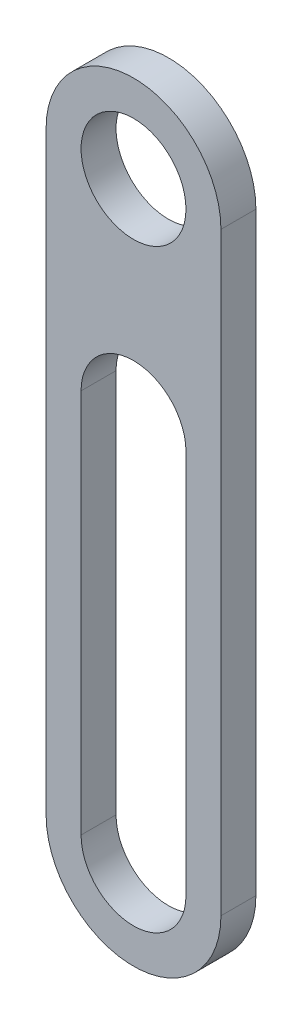
ISO-10303-21;
HEADER;
FILE_DESCRIPTION(('STEP AP214'),'2;1');
FILE_NAME('part.step','',(''),(''),'','','');
FILE_SCHEMA(('AUTOMOTIVE_DESIGN { 1 0 10303 214 1 1 1 1 }'));
ENDSEC;
DATA;
#1=APPLICATION_CONTEXT('core data for automotive mechanical design processes');
#2=APPLICATION_PROTOCOL_DEFINITION('international standard','automotive_design',2000,#1);
#3=PRODUCT_CONTEXT('',#1,'mechanical');
#4=PRODUCT('Part','Part','',(#3));
#5=PRODUCT_RELATED_PRODUCT_CATEGORY('part','',(#4));
#6=PRODUCT_DEFINITION_FORMATION('','',#4);
#7=PRODUCT_DEFINITION_CONTEXT('part definition',#1,'design');
#8=PRODUCT_DEFINITION('design','',#6,#7);
#9=PRODUCT_DEFINITION_SHAPE('','',#8);
#10=(LENGTH_UNIT() NAMED_UNIT(*) SI_UNIT(.MILLI.,.METRE.));
#11=(NAMED_UNIT(*) PLANE_ANGLE_UNIT() SI_UNIT($,.RADIAN.));
#12=(NAMED_UNIT(*) SI_UNIT($,.STERADIAN.) SOLID_ANGLE_UNIT());
#13=UNCERTAINTY_MEASURE_WITH_UNIT(LENGTH_MEASURE(1.E-05),#10,'distance_accuracy_value','');
#14=(GEOMETRIC_REPRESENTATION_CONTEXT(3) GLOBAL_UNCERTAINTY_ASSIGNED_CONTEXT((#13)) GLOBAL_UNIT_ASSIGNED_CONTEXT((#10,
#11,#12)) REPRESENTATION_CONTEXT('',''));
#15=CARTESIAN_POINT('',(0.,0.,0.));
#16=DIRECTION('',(0.,0.,1.));
#17=DIRECTION('',(1.,0.,0.));
#18=AXIS2_PLACEMENT_3D('',#15,#16,#17);
#19=CARTESIAN_POINT('',(0.,11.5,1.));
#20=DIRECTION('',(0.,0.,-1.));
#21=DIRECTION('',(-1.,0.,0.));
#22=AXIS2_PLACEMENT_3D('',#19,#20,#21);
#23=PLANE('',#22);
#24=CARTESIAN_POINT('',(0.,11.5,1.));
#25=DIRECTION('',(0.,0.,1.));
#26=DIRECTION('',(-1.,0.,0.));
#27=AXIS2_PLACEMENT_3D('',#24,#25,#26);
#28=CIRCLE('',#27,2.5);
#29=CARTESIAN_POINT('',(2.5,11.5,1.));
#30=VERTEX_POINT('',#29);
#31=CARTESIAN_POINT('',(-2.5,11.5,1.));
#32=VERTEX_POINT('',#31);
#33=EDGE_CURVE('E141',#30,#32,#28,.T.);
#34=ORIENTED_EDGE('',*,*,#33,.T.);
#35=DIRECTION('',(0.,-1.,0.));
#36=VECTOR('',#35,1.);
#37=CARTESIAN_POINT('',(-2.5,11.5,1.));
#38=LINE('',#37,#36);
#39=CARTESIAN_POINT('',(-2.5,-5.5,1.));
#40=VERTEX_POINT('',#39);
#41=EDGE_CURVE('E144',#32,#40,#38,.T.);
#42=ORIENTED_EDGE('',*,*,#41,.T.);
#43=CARTESIAN_POINT('',(0.,-5.5,1.));
#44=DIRECTION('',(0.,0.,1.));
#45=DIRECTION('',(1.,0.,0.));
#46=AXIS2_PLACEMENT_3D('',#43,#44,#45);
#47=CIRCLE('',#46,2.5);
#48=CARTESIAN_POINT('',(2.5,-5.5,1.));
#49=VERTEX_POINT('',#48);
#50=EDGE_CURVE('E147',#40,#49,#47,.T.);
#51=ORIENTED_EDGE('',*,*,#50,.T.);
#52=DIRECTION('',(0.,1.,0.));
#53=VECTOR('',#52,1.);
#54=CARTESIAN_POINT('',(2.5,11.5,1.));
#55=LINE('',#54,#53);
#56=EDGE_CURVE('E149',#49,#30,#55,.T.);
#57=ORIENTED_EDGE('',*,*,#56,.T.);
#58=EDGE_LOOP('',(#34,#42,#51,#57));
#59=FACE_BOUND('',#58,.T.);
#60=CARTESIAN_POINT('',(0.,-5.5,1.));
#61=DIRECTION('',(0.,0.,1.));
#62=DIRECTION('',(1.,0.,0.));
#63=AXIS2_PLACEMENT_3D('',#60,#61,#62);
#64=CIRCLE('',#63,1.5);
#65=CARTESIAN_POINT('',(-1.5,-5.5,1.));
#66=VERTEX_POINT('',#65);
#67=CARTESIAN_POINT('',(1.5,-5.5,1.));
#68=VERTEX_POINT('',#67);
#69=EDGE_CURVE('E102',#66,#68,#64,.T.);
#70=ORIENTED_EDGE('',*,*,#69,.F.);
#71=DIRECTION('',(0.,-1.,0.));
#72=VECTOR('',#71,1.);
#73=CARTESIAN_POINT('',(-1.5,-5.5,1.));
#74=LINE('',#73,#72);
#75=CARTESIAN_POINT('',(-1.5,5.5,1.));
#76=VERTEX_POINT('',#75);
#77=EDGE_CURVE('E125',#76,#66,#74,.T.);
#78=ORIENTED_EDGE('',*,*,#77,.F.);
#79=CARTESIAN_POINT('',(0.,5.5,1.));
#80=DIRECTION('',(0.,0.,1.));
#81=DIRECTION('',(1.,0.,0.));
#82=AXIS2_PLACEMENT_3D('',#79,#80,#81);
#83=CIRCLE('',#82,1.5);
#84=CARTESIAN_POINT('',(1.5,5.5,1.));
#85=VERTEX_POINT('',#84);
#86=EDGE_CURVE('E123',#85,#76,#83,.T.);
#87=ORIENTED_EDGE('',*,*,#86,.F.);
#88=DIRECTION('',(0.,1.,0.));
#89=VECTOR('',#88,1.);
#90=CARTESIAN_POINT('',(1.5,-5.5,1.));
#91=LINE('',#90,#89);
#92=EDGE_CURVE('E110',#68,#85,#91,.T.);
#93=ORIENTED_EDGE('',*,*,#92,.F.);
#94=EDGE_LOOP('',(#70,#78,#87,#93));
#95=FACE_BOUND('',#94,.T.);
#96=CARTESIAN_POINT('',(0.,11.5,1.));
#97=DIRECTION('',(0.,0.,1.));
#98=DIRECTION('',(1.,0.,0.));
#99=AXIS2_PLACEMENT_3D('',#96,#97,#98);
#100=CIRCLE('',#99,1.5);
#101=CARTESIAN_POINT('',(1.5,11.5,1.));
#102=VERTEX_POINT('',#101);
#103=EDGE_CURVE('E131',#102,#102,#100,.T.);
#104=ORIENTED_EDGE('',*,*,#103,.F.);
#105=EDGE_LOOP('',(#104));
#106=FACE_BOUND('',#105,.T.);
#107=ADVANCED_FACE('F37',(#59,#95,#106),#23,.F.);
#108=CARTESIAN_POINT('',(0.,11.5,0.));
#109=DIRECTION('',(0.,0.,-1.));
#110=DIRECTION('',(-1.,0.,0.));
#111=AXIS2_PLACEMENT_3D('',#108,#109,#110);
#112=PLANE('',#111);
#113=DIRECTION('',(0.,-1.,0.));
#114=VECTOR('',#113,1.);
#115=CARTESIAN_POINT('',(-1.5,-5.5,0.));
#116=LINE('',#115,#114);
#117=CARTESIAN_POINT('',(-1.5,5.5,0.));
#118=VERTEX_POINT('',#117);
#119=CARTESIAN_POINT('',(-1.5,-5.5,0.));
#120=VERTEX_POINT('',#119);
#121=EDGE_CURVE('E111',#118,#120,#116,.T.);
#122=ORIENTED_EDGE('',*,*,#121,.T.);
#123=CARTESIAN_POINT('',(0.,-5.5,0.));
#124=DIRECTION('',(0.,0.,1.));
#125=DIRECTION('',(1.,0.,0.));
#126=AXIS2_PLACEMENT_3D('',#123,#124,#125);
#127=CIRCLE('',#126,1.5);
#128=CARTESIAN_POINT('',(1.5,-5.5,0.));
#129=VERTEX_POINT('',#128);
#130=EDGE_CURVE('E60',#120,#129,#127,.T.);
#131=ORIENTED_EDGE('',*,*,#130,.T.);
#132=DIRECTION('',(0.,1.,0.));
#133=VECTOR('',#132,1.);
#134=CARTESIAN_POINT('',(1.5,-5.5,0.));
#135=LINE('',#134,#133);
#136=CARTESIAN_POINT('',(1.5,5.5,0.));
#137=VERTEX_POINT('',#136);
#138=EDGE_CURVE('E117',#129,#137,#135,.T.);
#139=ORIENTED_EDGE('',*,*,#138,.T.);
#140=CARTESIAN_POINT('',(0.,5.5,0.));
#141=DIRECTION('',(0.,0.,1.));
#142=DIRECTION('',(1.,0.,0.));
#143=AXIS2_PLACEMENT_3D('',#140,#141,#142);
#144=CIRCLE('',#143,1.5);
#145=EDGE_CURVE('E133',#137,#118,#144,.T.);
#146=ORIENTED_EDGE('',*,*,#145,.T.);
#147=EDGE_LOOP('',(#122,#131,#139,#146));
#148=FACE_BOUND('',#147,.T.);
#149=CARTESIAN_POINT('',(0.,11.5,0.));
#150=DIRECTION('',(0.,0.,1.));
#151=DIRECTION('',(-1.,0.,0.));
#152=AXIS2_PLACEMENT_3D('',#149,#150,#151);
#153=CIRCLE('',#152,2.5);
#154=CARTESIAN_POINT('',(2.5,11.5,0.));
#155=VERTEX_POINT('',#154);
#156=CARTESIAN_POINT('',(-2.5,11.5,0.));
#157=VERTEX_POINT('',#156);
#158=EDGE_CURVE('E118',#155,#157,#153,.T.);
#159=ORIENTED_EDGE('',*,*,#158,.F.);
#160=DIRECTION('',(0.,1.,0.));
#161=VECTOR('',#160,1.);
#162=CARTESIAN_POINT('',(2.5,11.5,0.));
#163=LINE('',#162,#161);
#164=CARTESIAN_POINT('',(2.5,-5.5,0.));
#165=VERTEX_POINT('',#164);
#166=EDGE_CURVE('E145',#165,#155,#163,.T.);
#167=ORIENTED_EDGE('',*,*,#166,.F.);
#168=CARTESIAN_POINT('',(0.,-5.5,0.));
#169=DIRECTION('',(0.,0.,1.));
#170=DIRECTION('',(1.,0.,0.));
#171=AXIS2_PLACEMENT_3D('',#168,#169,#170);
#172=CIRCLE('',#171,2.5);
#173=CARTESIAN_POINT('',(-2.5,-5.5,0.));
#174=VERTEX_POINT('',#173);
#175=EDGE_CURVE('E156',#174,#165,#172,.T.);
#176=ORIENTED_EDGE('',*,*,#175,.F.);
#177=DIRECTION('',(0.,-1.,0.));
#178=VECTOR('',#177,1.);
#179=CARTESIAN_POINT('',(-2.5,11.5,0.));
#180=LINE('',#179,#178);
#181=EDGE_CURVE('E154',#157,#174,#180,.T.);
#182=ORIENTED_EDGE('',*,*,#181,.F.);
#183=EDGE_LOOP('',(#159,#167,#176,#182));
#184=FACE_BOUND('',#183,.T.);
#185=CARTESIAN_POINT('',(0.,11.5,0.));
#186=DIRECTION('',(0.,0.,1.));
#187=DIRECTION('',(1.,0.,0.));
#188=AXIS2_PLACEMENT_3D('',#185,#186,#187);
#189=CIRCLE('',#188,1.5);
#190=CARTESIAN_POINT('',(1.5,11.5,0.));
#191=VERTEX_POINT('',#190);
#192=EDGE_CURVE('E228',#191,#191,#189,.T.);
#193=ORIENTED_EDGE('',*,*,#192,.T.);
#194=EDGE_LOOP('',(#193));
#195=FACE_BOUND('',#194,.T.);
#196=ADVANCED_FACE('F174',(#148,#184,#195),#112,.T.);
#197=CARTESIAN_POINT('',(0.,11.5,1.));
#198=DIRECTION('',(0.,0.,-1.));
#199=DIRECTION('',(-1.,0.,0.));
#200=AXIS2_PLACEMENT_3D('',#197,#198,#199);
#201=CYLINDRICAL_SURFACE('',#200,2.5);
#202=ORIENTED_EDGE('',*,*,#158,.T.);
#203=DIRECTION('',(0.,0.,-1.));
#204=VECTOR('',#203,1.);
#205=CARTESIAN_POINT('',(-2.5,11.5,1.));
#206=LINE('',#205,#204);
#207=EDGE_CURVE('E11',#32,#157,#206,.T.);
#208=ORIENTED_EDGE('',*,*,#207,.F.);
#209=ORIENTED_EDGE('',*,*,#33,.F.);
#210=DIRECTION('',(0.,0.,-1.));
#211=VECTOR('',#210,1.);
#212=CARTESIAN_POINT('',(2.5,11.5,1.));
#213=LINE('',#212,#211);
#214=EDGE_CURVE('E151',#30,#155,#213,.T.);
#215=ORIENTED_EDGE('',*,*,#214,.T.);
#216=EDGE_LOOP('',(#202,#208,#209,#215));
#217=FACE_BOUND('',#216,.T.);
#218=ADVANCED_FACE('F39',(#217),#201,.T.);
#219=CARTESIAN_POINT('',(-2.5,11.5,1.));
#220=DIRECTION('',(1.,0.,0.));
#221=DIRECTION('',(0.,0.,-1.));
#222=AXIS2_PLACEMENT_3D('',#219,#220,#221);
#223=PLANE('',#222);
#224=ORIENTED_EDGE('',*,*,#181,.T.);
#225=DIRECTION('',(0.,0.,-1.));
#226=VECTOR('',#225,1.);
#227=CARTESIAN_POINT('',(-2.5,-5.5,1.));
#228=LINE('',#227,#226);
#229=EDGE_CURVE('E45',#40,#174,#228,.T.);
#230=ORIENTED_EDGE('',*,*,#229,.F.);
#231=ORIENTED_EDGE('',*,*,#41,.F.);
#232=ORIENTED_EDGE('',*,*,#207,.T.);
#233=EDGE_LOOP('',(#224,#230,#231,#232));
#234=FACE_BOUND('',#233,.T.);
#235=ADVANCED_FACE('F184',(#234),#223,.F.);
#236=CARTESIAN_POINT('',(0.,-5.5,1.));
#237=DIRECTION('',(0.,0.,-1.));
#238=DIRECTION('',(-1.,0.,0.));
#239=AXIS2_PLACEMENT_3D('',#236,#237,#238);
#240=CYLINDRICAL_SURFACE('',#239,2.5);
#241=ORIENTED_EDGE('',*,*,#175,.T.);
#242=DIRECTION('',(0.,0.,-1.));
#243=VECTOR('',#242,1.);
#244=CARTESIAN_POINT('',(2.5,-5.5,1.));
#245=LINE('',#244,#243);
#246=EDGE_CURVE('E161',#49,#165,#245,.T.);
#247=ORIENTED_EDGE('',*,*,#246,.F.);
#248=ORIENTED_EDGE('',*,*,#50,.F.);
#249=ORIENTED_EDGE('',*,*,#229,.T.);
#250=EDGE_LOOP('',(#241,#247,#248,#249));
#251=FACE_BOUND('',#250,.T.);
#252=ADVANCED_FACE('F168',(#251),#240,.T.);
#253=CARTESIAN_POINT('',(2.5,11.5,1.));
#254=DIRECTION('',(-1.,0.,0.));
#255=DIRECTION('',(0.,0.,1.));
#256=AXIS2_PLACEMENT_3D('',#253,#254,#255);
#257=PLANE('',#256);
#258=ORIENTED_EDGE('',*,*,#166,.T.);
#259=ORIENTED_EDGE('',*,*,#214,.F.);
#260=ORIENTED_EDGE('',*,*,#56,.F.);
#261=ORIENTED_EDGE('',*,*,#246,.T.);
#262=EDGE_LOOP('',(#258,#259,#260,#261));
#263=FACE_BOUND('',#262,.T.);
#264=ADVANCED_FACE('F178',(#263),#257,.F.);
#265=CARTESIAN_POINT('',(0.,-5.5,1.));
#266=DIRECTION('',(0.,0.,-1.));
#267=DIRECTION('',(-1.,0.,0.));
#268=AXIS2_PLACEMENT_3D('',#265,#266,#267);
#269=CYLINDRICAL_SURFACE('',#268,1.5);
#270=ORIENTED_EDGE('',*,*,#130,.F.);
#271=DIRECTION('',(0.,0.,-1.));
#272=VECTOR('',#271,1.);
#273=CARTESIAN_POINT('',(-1.5,-5.5,1.));
#274=LINE('',#273,#272);
#275=EDGE_CURVE('E106',#66,#120,#274,.T.);
#276=ORIENTED_EDGE('',*,*,#275,.F.);
#277=ORIENTED_EDGE('',*,*,#69,.T.);
#278=DIRECTION('',(0.,0.,-1.));
#279=VECTOR('',#278,1.);
#280=CARTESIAN_POINT('',(1.5,-5.5,1.));
#281=LINE('',#280,#279);
#282=EDGE_CURVE('E105',#68,#129,#281,.T.);
#283=ORIENTED_EDGE('',*,*,#282,.T.);
#284=EDGE_LOOP('',(#270,#276,#277,#283));
#285=FACE_BOUND('',#284,.T.);
#286=ADVANCED_FACE('F104',(#285),#269,.F.);
#287=CARTESIAN_POINT('',(1.5,-5.5,1.));
#288=DIRECTION('',(-1.,0.,0.));
#289=DIRECTION('',(0.,-1.,0.));
#290=AXIS2_PLACEMENT_3D('',#287,#288,#289);
#291=PLANE('',#290);
#292=ORIENTED_EDGE('',*,*,#138,.F.);
#293=ORIENTED_EDGE('',*,*,#282,.F.);
#294=ORIENTED_EDGE('',*,*,#92,.T.);
#295=DIRECTION('',(0.,0.,-1.));
#296=VECTOR('',#295,1.);
#297=CARTESIAN_POINT('',(1.5,5.5,1.));
#298=LINE('',#297,#296);
#299=EDGE_CURVE('E119',#85,#137,#298,.T.);
#300=ORIENTED_EDGE('',*,*,#299,.T.);
#301=EDGE_LOOP('',(#292,#293,#294,#300));
#302=FACE_BOUND('',#301,.T.);
#303=ADVANCED_FACE('F114',(#302),#291,.T.);
#304=CARTESIAN_POINT('',(0.,5.5,1.));
#305=DIRECTION('',(0.,0.,-1.));
#306=DIRECTION('',(-1.,0.,0.));
#307=AXIS2_PLACEMENT_3D('',#304,#305,#306);
#308=CYLINDRICAL_SURFACE('',#307,1.5);
#309=ORIENTED_EDGE('',*,*,#145,.F.);
#310=ORIENTED_EDGE('',*,*,#299,.F.);
#311=ORIENTED_EDGE('',*,*,#86,.T.);
#312=DIRECTION('',(0.,0.,-1.));
#313=VECTOR('',#312,1.);
#314=CARTESIAN_POINT('',(-1.5,5.5,1.));
#315=LINE('',#314,#313);
#316=EDGE_CURVE('E52',#76,#118,#315,.T.);
#317=ORIENTED_EDGE('',*,*,#316,.T.);
#318=EDGE_LOOP('',(#309,#310,#311,#317));
#319=FACE_BOUND('',#318,.T.);
#320=ADVANCED_FACE('F208',(#319),#308,.F.);
#321=CARTESIAN_POINT('',(-1.5,-5.5,1.));
#322=DIRECTION('',(1.,0.,0.));
#323=DIRECTION('',(0.,1.,0.));
#324=AXIS2_PLACEMENT_3D('',#321,#322,#323);
#325=PLANE('',#324);
#326=ORIENTED_EDGE('',*,*,#121,.F.);
#327=ORIENTED_EDGE('',*,*,#316,.F.);
#328=ORIENTED_EDGE('',*,*,#77,.T.);
#329=ORIENTED_EDGE('',*,*,#275,.T.);
#330=EDGE_LOOP('',(#326,#327,#328,#329));
#331=FACE_BOUND('',#330,.T.);
#332=ADVANCED_FACE('F212',(#331),#325,.T.);
#333=CARTESIAN_POINT('',(0.,11.5,1.));
#334=DIRECTION('',(0.,0.,-1.));
#335=DIRECTION('',(-1.,0.,0.));
#336=AXIS2_PLACEMENT_3D('',#333,#334,#335);
#337=CYLINDRICAL_SURFACE('',#336,1.5);
#338=ORIENTED_EDGE('',*,*,#103,.T.);
#339=EDGE_LOOP('',(#338));
#340=FACE_BOUND('',#339,.T.);
#341=ORIENTED_EDGE('',*,*,#192,.F.);
#342=EDGE_LOOP('',(#341));
#343=FACE_BOUND('',#342,.T.);
#344=ADVANCED_FACE('F218',(#340,#343),#337,.F.);
#345=CLOSED_SHELL('',(#107,#196,#218,#235,#252,#264,#286,#303,#320,#332,#344));
#346=MANIFOLD_SOLID_BREP('B2',#345);
#347=ADVANCED_BREP_SHAPE_REPRESENTATION('',(#18,#346),#14);
#348=SHAPE_DEFINITION_REPRESENTATION(#9,#347);
ENDSEC;
END-ISO-10303-21;
